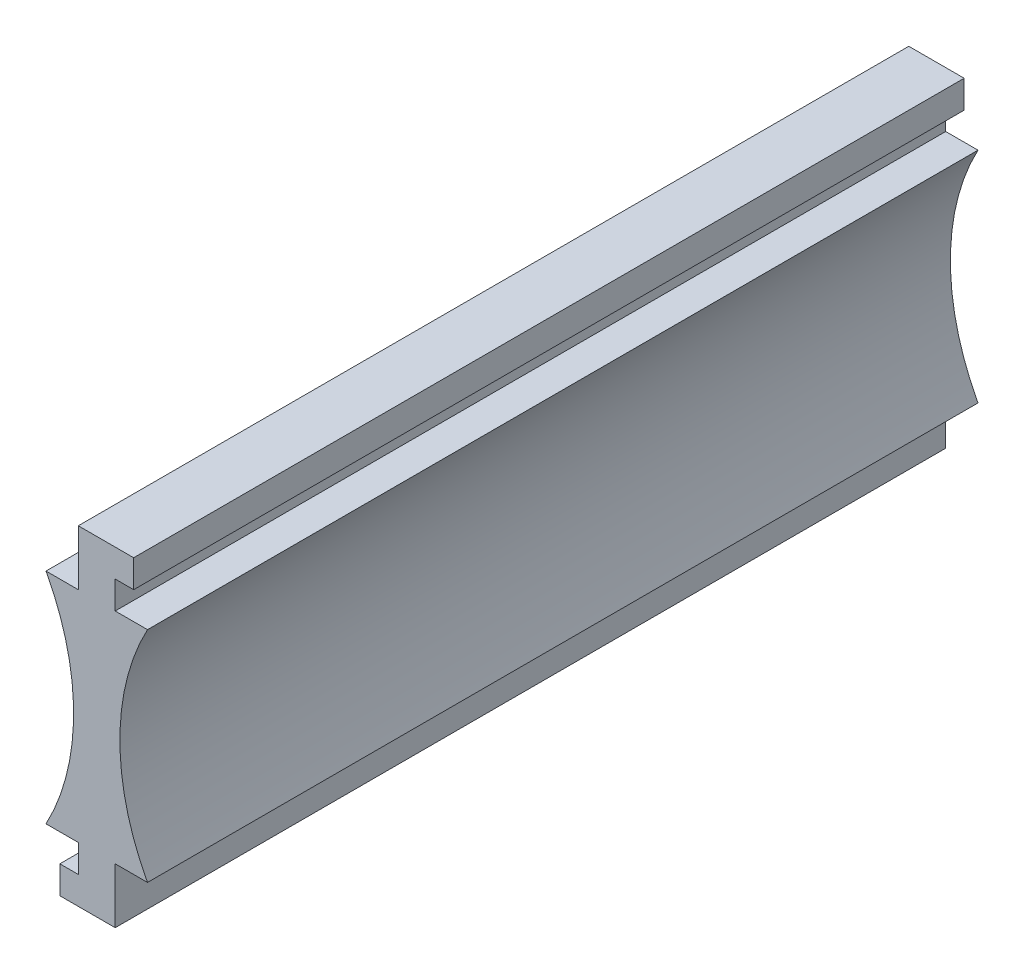
ISO-10303-21;
HEADER;
FILE_DESCRIPTION(('STEP AP214'),'2;1');
FILE_NAME('part.step','',(''),(''),'','','');
FILE_SCHEMA(('AUTOMOTIVE_DESIGN { 1 0 10303 214 1 1 1 1 }'));
ENDSEC;
DATA;
#1=APPLICATION_CONTEXT('core data for automotive mechanical design processes');
#2=APPLICATION_PROTOCOL_DEFINITION('international standard','automotive_design',2000,#1);
#3=PRODUCT_CONTEXT('',#1,'mechanical');
#4=PRODUCT('Part','Part','',(#3));
#5=PRODUCT_RELATED_PRODUCT_CATEGORY('part','',(#4));
#6=PRODUCT_DEFINITION_FORMATION('','',#4);
#7=PRODUCT_DEFINITION_CONTEXT('part definition',#1,'design');
#8=PRODUCT_DEFINITION('design','',#6,#7);
#9=PRODUCT_DEFINITION_SHAPE('','',#8);
#10=(LENGTH_UNIT() NAMED_UNIT(*) SI_UNIT(.MILLI.,.METRE.));
#11=(NAMED_UNIT(*) PLANE_ANGLE_UNIT() SI_UNIT($,.RADIAN.));
#12=(NAMED_UNIT(*) SI_UNIT($,.STERADIAN.) SOLID_ANGLE_UNIT());
#13=UNCERTAINTY_MEASURE_WITH_UNIT(LENGTH_MEASURE(1.E-05),#10,'distance_accuracy_value','');
#14=(GEOMETRIC_REPRESENTATION_CONTEXT(3) GLOBAL_UNCERTAINTY_ASSIGNED_CONTEXT((#13)) GLOBAL_UNIT_ASSIGNED_CONTEXT((#10,
#11,#12)) REPRESENTATION_CONTEXT('',''));
#15=CARTESIAN_POINT('',(0.,0.,0.));
#16=DIRECTION('',(0.,0.,1.));
#17=DIRECTION('',(1.,0.,0.));
#18=AXIS2_PLACEMENT_3D('',#15,#16,#17);
#19=CARTESIAN_POINT('',(-55.0127751340449,0.,-180.));
#20=DIRECTION('',(0.,0.,1.));
#21=DIRECTION('',(1.,0.,0.));
#22=AXIS2_PLACEMENT_3D('',#19,#20,#21);
#23=CYLINDRICAL_SURFACE('',#22,50.);
#24=CARTESIAN_POINT('',(-55.0127751340449,0.,0.));
#25=DIRECTION('',(0.,0.,-1.));
#26=DIRECTION('',(1.,0.,0.));
#27=AXIS2_PLACEMENT_3D('',#24,#25,#26);
#28=CIRCLE('',#27,50.);
#29=CARTESIAN_POINT('',(-11.,23.725,0.));
#30=VERTEX_POINT('',#29);
#31=CARTESIAN_POINT('',(-11.,-23.725,0.));
#32=VERTEX_POINT('',#31);
#33=EDGE_CURVE('E182',#30,#32,#28,.T.);
#34=ORIENTED_EDGE('',*,*,#33,.F.);
#35=DIRECTION('',(0.,0.,1.));
#36=VECTOR('',#35,1.);
#37=CARTESIAN_POINT('',(-11.,23.725,-180.));
#38=LINE('',#37,#36);
#39=CARTESIAN_POINT('',(-11.,23.725,-180.));
#40=VERTEX_POINT('',#39);
#41=EDGE_CURVE('E11',#40,#30,#38,.T.);
#42=ORIENTED_EDGE('',*,*,#41,.F.);
#43=CARTESIAN_POINT('',(-55.0127751340449,0.,-180.));
#44=DIRECTION('',(0.,0.,-1.));
#45=DIRECTION('',(1.,0.,0.));
#46=AXIS2_PLACEMENT_3D('',#43,#44,#45);
#47=CIRCLE('',#46,50.);
#48=CARTESIAN_POINT('',(-11.,-23.725,-180.));
#49=VERTEX_POINT('',#48);
#50=EDGE_CURVE('E226',#40,#49,#47,.T.);
#51=ORIENTED_EDGE('',*,*,#50,.T.);
#52=DIRECTION('',(0.,0.,1.));
#53=VECTOR('',#52,1.);
#54=CARTESIAN_POINT('',(-11.,-23.725,-180.));
#55=LINE('',#54,#53);
#56=EDGE_CURVE('E40',#49,#32,#55,.T.);
#57=ORIENTED_EDGE('',*,*,#56,.T.);
#58=EDGE_LOOP('',(#34,#42,#51,#57));
#59=FACE_BOUND('',#58,.T.);
#60=ADVANCED_FACE('F37',(#59),#23,.F.);
#61=CARTESIAN_POINT('',(-11.,23.725,-180.));
#62=DIRECTION('',(0.,1.,0.));
#63=DIRECTION('',(-1.,0.,0.));
#64=AXIS2_PLACEMENT_3D('',#61,#62,#63);
#65=PLANE('',#64);
#66=DIRECTION('',(-1.,0.,0.));
#67=VECTOR('',#66,1.);
#68=CARTESIAN_POINT('',(-11.,23.725,0.));
#69=LINE('',#68,#67);
#70=CARTESIAN_POINT('',(-3.99999999999999,23.725,0.));
#71=VERTEX_POINT('',#70);
#72=EDGE_CURVE('E224',#71,#30,#69,.T.);
#73=ORIENTED_EDGE('',*,*,#72,.F.);
#74=DIRECTION('',(0.,0.,1.));
#75=VECTOR('',#74,1.);
#76=CARTESIAN_POINT('',(-3.99999999999999,23.725,-180.));
#77=LINE('',#76,#75);
#78=CARTESIAN_POINT('',(-3.99999999999999,23.725,-180.));
#79=VERTEX_POINT('',#78);
#80=EDGE_CURVE('E46',#79,#71,#77,.T.);
#81=ORIENTED_EDGE('',*,*,#80,.F.);
#82=DIRECTION('',(-1.,0.,0.));
#83=VECTOR('',#82,1.);
#84=CARTESIAN_POINT('',(-11.,23.725,-180.));
#85=LINE('',#84,#83);
#86=EDGE_CURVE('E172',#79,#40,#85,.T.);
#87=ORIENTED_EDGE('',*,*,#86,.T.);
#88=ORIENTED_EDGE('',*,*,#41,.T.);
#89=EDGE_LOOP('',(#73,#81,#87,#88));
#90=FACE_BOUND('',#89,.T.);
#91=ADVANCED_FACE('F254',(#90),#65,.T.);
#92=CARTESIAN_POINT('',(-3.99999999999999,35.7250000000001,-180.));
#93=DIRECTION('',(-1.,0.,0.));
#94=DIRECTION('',(0.,0.,1.));
#95=AXIS2_PLACEMENT_3D('',#92,#93,#94);
#96=PLANE('',#95);
#97=DIRECTION('',(0.,-1.,0.));
#98=VECTOR('',#97,1.);
#99=CARTESIAN_POINT('',(-3.99999999999999,35.7250000000001,0.));
#100=LINE('',#99,#98);
#101=CARTESIAN_POINT('',(-3.99999999999999,35.7250000000001,0.));
#102=VERTEX_POINT('',#101);
#103=EDGE_CURVE('E159',#102,#71,#100,.T.);
#104=ORIENTED_EDGE('',*,*,#103,.F.);
#105=DIRECTION('',(0.,0.,1.));
#106=VECTOR('',#105,1.);
#107=CARTESIAN_POINT('',(-3.99999999999999,35.7250000000001,-180.));
#108=LINE('',#107,#106);
#109=CARTESIAN_POINT('',(-3.99999999999999,35.7250000000001,-180.));
#110=VERTEX_POINT('',#109);
#111=EDGE_CURVE('E154',#110,#102,#108,.T.);
#112=ORIENTED_EDGE('',*,*,#111,.F.);
#113=DIRECTION('',(0.,-1.,0.));
#114=VECTOR('',#113,1.);
#115=CARTESIAN_POINT('',(-3.99999999999999,35.7250000000001,-180.));
#116=LINE('',#115,#114);
#117=EDGE_CURVE('E157',#110,#79,#116,.T.);
#118=ORIENTED_EDGE('',*,*,#117,.T.);
#119=ORIENTED_EDGE('',*,*,#80,.T.);
#120=EDGE_LOOP('',(#104,#112,#118,#119));
#121=FACE_BOUND('',#120,.T.);
#122=ADVANCED_FACE('F156',(#121),#96,.T.);
#123=CARTESIAN_POINT('',(8.00000000000001,35.7250000000001,-180.));
#124=DIRECTION('',(0.,1.,0.));
#125=DIRECTION('',(0.,0.,1.));
#126=AXIS2_PLACEMENT_3D('',#123,#124,#125);
#127=PLANE('',#126);
#128=DIRECTION('',(-1.,0.,0.));
#129=VECTOR('',#128,1.);
#130=CARTESIAN_POINT('',(8.00000000000001,35.7250000000001,0.));
#131=LINE('',#130,#129);
#132=CARTESIAN_POINT('',(8.00000000000001,35.7250000000001,0.));
#133=VERTEX_POINT('',#132);
#134=EDGE_CURVE('E221',#133,#102,#131,.T.);
#135=ORIENTED_EDGE('',*,*,#134,.F.);
#136=DIRECTION('',(0.,0.,1.));
#137=VECTOR('',#136,1.);
#138=CARTESIAN_POINT('',(8.00000000000001,35.7250000000001,-180.));
#139=LINE('',#138,#137);
#140=CARTESIAN_POINT('',(8.00000000000001,35.7250000000001,-180.));
#141=VERTEX_POINT('',#140);
#142=EDGE_CURVE('E164',#141,#133,#139,.T.);
#143=ORIENTED_EDGE('',*,*,#142,.F.);
#144=DIRECTION('',(-1.,0.,0.));
#145=VECTOR('',#144,1.);
#146=CARTESIAN_POINT('',(8.00000000000001,35.7250000000001,-180.));
#147=LINE('',#146,#145);
#148=EDGE_CURVE('E170',#141,#110,#147,.T.);
#149=ORIENTED_EDGE('',*,*,#148,.T.);
#150=ORIENTED_EDGE('',*,*,#111,.T.);
#151=EDGE_LOOP('',(#135,#143,#149,#150));
#152=FACE_BOUND('',#151,.T.);
#153=ADVANCED_FACE('F174',(#152),#127,.T.);
#154=CARTESIAN_POINT('',(8.00000000000001,29.7250000000001,-180.));
#155=DIRECTION('',(1.,0.,0.));
#156=DIRECTION('',(0.,0.,-1.));
#157=AXIS2_PLACEMENT_3D('',#154,#155,#156);
#158=PLANE('',#157);
#159=DIRECTION('',(0.,1.,0.));
#160=VECTOR('',#159,1.);
#161=CARTESIAN_POINT('',(8.00000000000001,29.7250000000001,0.));
#162=LINE('',#161,#160);
#163=CARTESIAN_POINT('',(8.00000000000001,29.7250000000001,0.));
#164=VERTEX_POINT('',#163);
#165=EDGE_CURVE('E218',#164,#133,#162,.T.);
#166=ORIENTED_EDGE('',*,*,#165,.F.);
#167=DIRECTION('',(0.,0.,1.));
#168=VECTOR('',#167,1.);
#169=CARTESIAN_POINT('',(8.00000000000001,29.7250000000001,-180.));
#170=LINE('',#169,#168);
#171=CARTESIAN_POINT('',(8.00000000000001,29.7250000000001,-180.));
#172=VERTEX_POINT('',#171);
#173=EDGE_CURVE('E230',#172,#164,#170,.T.);
#174=ORIENTED_EDGE('',*,*,#173,.F.);
#175=DIRECTION('',(0.,1.,0.));
#176=VECTOR('',#175,1.);
#177=CARTESIAN_POINT('',(8.00000000000001,29.7250000000001,-180.));
#178=LINE('',#177,#176);
#179=EDGE_CURVE('E175',#172,#141,#178,.T.);
#180=ORIENTED_EDGE('',*,*,#179,.T.);
#181=ORIENTED_EDGE('',*,*,#142,.T.);
#182=EDGE_LOOP('',(#166,#174,#180,#181));
#183=FACE_BOUND('',#182,.T.);
#184=ADVANCED_FACE('F267',(#183),#158,.T.);
#185=CARTESIAN_POINT('',(4.00000000000001,29.7250000000001,-180.));
#186=DIRECTION('',(0.,-1.,0.));
#187=DIRECTION('',(0.,0.,-1.));
#188=AXIS2_PLACEMENT_3D('',#185,#186,#187);
#189=PLANE('',#188);
#190=DIRECTION('',(1.,0.,0.));
#191=VECTOR('',#190,1.);
#192=CARTESIAN_POINT('',(4.00000000000001,29.7250000000001,0.));
#193=LINE('',#192,#191);
#194=CARTESIAN_POINT('',(4.00000000000001,29.7250000000001,0.));
#195=VERTEX_POINT('',#194);
#196=EDGE_CURVE('E215',#195,#164,#193,.T.);
#197=ORIENTED_EDGE('',*,*,#196,.F.);
#198=DIRECTION('',(0.,0.,1.));
#199=VECTOR('',#198,1.);
#200=CARTESIAN_POINT('',(4.00000000000001,29.7250000000001,-180.));
#201=LINE('',#200,#199);
#202=CARTESIAN_POINT('',(4.00000000000001,29.7250000000001,-180.));
#203=VERTEX_POINT('',#202);
#204=EDGE_CURVE('E232',#203,#195,#201,.T.);
#205=ORIENTED_EDGE('',*,*,#204,.F.);
#206=DIRECTION('',(1.,0.,0.));
#207=VECTOR('',#206,1.);
#208=CARTESIAN_POINT('',(4.00000000000001,29.7250000000001,-180.));
#209=LINE('',#208,#207);
#210=EDGE_CURVE('E177',#203,#172,#209,.T.);
#211=ORIENTED_EDGE('',*,*,#210,.T.);
#212=ORIENTED_EDGE('',*,*,#173,.T.);
#213=EDGE_LOOP('',(#197,#205,#211,#212));
#214=FACE_BOUND('',#213,.T.);
#215=ADVANCED_FACE('F270',(#214),#189,.T.);
#216=CARTESIAN_POINT('',(4.00000000000001,23.725,-180.));
#217=DIRECTION('',(1.,0.,0.));
#218=DIRECTION('',(0.,0.,-1.));
#219=AXIS2_PLACEMENT_3D('',#216,#217,#218);
#220=PLANE('',#219);
#221=DIRECTION('',(0.,1.,0.));
#222=VECTOR('',#221,1.);
#223=CARTESIAN_POINT('',(4.00000000000001,23.725,0.));
#224=LINE('',#223,#222);
#225=CARTESIAN_POINT('',(4.00000000000001,23.725,0.));
#226=VERTEX_POINT('',#225);
#227=EDGE_CURVE('E212',#226,#195,#224,.T.);
#228=ORIENTED_EDGE('',*,*,#227,.F.);
#229=DIRECTION('',(0.,0.,1.));
#230=VECTOR('',#229,1.);
#231=CARTESIAN_POINT('',(4.00000000000001,23.725,-180.));
#232=LINE('',#231,#230);
#233=CARTESIAN_POINT('',(4.00000000000001,23.725,-180.));
#234=VERTEX_POINT('',#233);
#235=EDGE_CURVE('E234',#234,#226,#232,.T.);
#236=ORIENTED_EDGE('',*,*,#235,.F.);
#237=DIRECTION('',(0.,1.,0.));
#238=VECTOR('',#237,1.);
#239=CARTESIAN_POINT('',(4.00000000000001,23.725,-180.));
#240=LINE('',#239,#238);
#241=EDGE_CURVE('E487',#234,#203,#240,.T.);
#242=ORIENTED_EDGE('',*,*,#241,.T.);
#243=ORIENTED_EDGE('',*,*,#204,.T.);
#244=EDGE_LOOP('',(#228,#236,#242,#243));
#245=FACE_BOUND('',#244,.T.);
#246=ADVANCED_FACE('F274',(#245),#220,.T.);
#247=CARTESIAN_POINT('',(4.00000000000001,23.725,-180.));
#248=DIRECTION('',(0.,1.,0.));
#249=DIRECTION('',(-1.,0.,0.));
#250=AXIS2_PLACEMENT_3D('',#247,#248,#249);
#251=PLANE('',#250);
#252=DIRECTION('',(-1.,0.,0.));
#253=VECTOR('',#252,1.);
#254=CARTESIAN_POINT('',(4.00000000000001,23.725,0.));
#255=LINE('',#254,#253);
#256=CARTESIAN_POINT('',(11.,23.725,0.));
#257=VERTEX_POINT('',#256);
#258=EDGE_CURVE('E209',#257,#226,#255,.T.);
#259=ORIENTED_EDGE('',*,*,#258,.F.);
#260=DIRECTION('',(0.,0.,1.));
#261=VECTOR('',#260,1.);
#262=CARTESIAN_POINT('',(11.,23.725,-180.));
#263=LINE('',#262,#261);
#264=CARTESIAN_POINT('',(11.,23.725,-180.));
#265=VERTEX_POINT('',#264);
#266=EDGE_CURVE('E236',#265,#257,#263,.T.);
#267=ORIENTED_EDGE('',*,*,#266,.F.);
#268=DIRECTION('',(-1.,0.,0.));
#269=VECTOR('',#268,1.);
#270=CARTESIAN_POINT('',(4.00000000000001,23.725,-180.));
#271=LINE('',#270,#269);
#272=EDGE_CURVE('E483',#265,#234,#271,.T.);
#273=ORIENTED_EDGE('',*,*,#272,.T.);
#274=ORIENTED_EDGE('',*,*,#235,.T.);
#275=EDGE_LOOP('',(#259,#267,#273,#274));
#276=FACE_BOUND('',#275,.T.);
#277=ADVANCED_FACE('F278',(#276),#251,.T.);
#278=CARTESIAN_POINT('',(55.0127751340449,0.,-180.));
#279=DIRECTION('',(0.,0.,1.));
#280=DIRECTION('',(1.,0.,0.));
#281=AXIS2_PLACEMENT_3D('',#278,#279,#280);
#282=CYLINDRICAL_SURFACE('',#281,50.);
#283=CARTESIAN_POINT('',(55.0127751340449,0.,0.));
#284=DIRECTION('',(0.,0.,-1.));
#285=DIRECTION('',(-1.,0.,0.));
#286=AXIS2_PLACEMENT_3D('',#283,#284,#285);
#287=CIRCLE('',#286,50.);
#288=CARTESIAN_POINT('',(11.,-23.725,0.));
#289=VERTEX_POINT('',#288);
#290=EDGE_CURVE('E206',#289,#257,#287,.T.);
#291=ORIENTED_EDGE('',*,*,#290,.F.);
#292=DIRECTION('',(0.,0.,1.));
#293=VECTOR('',#292,1.);
#294=CARTESIAN_POINT('',(11.,-23.725,-180.));
#295=LINE('',#294,#293);
#296=CARTESIAN_POINT('',(11.,-23.725,-180.));
#297=VERTEX_POINT('',#296);
#298=EDGE_CURVE('E238',#297,#289,#295,.T.);
#299=ORIENTED_EDGE('',*,*,#298,.F.);
#300=CARTESIAN_POINT('',(55.0127751340449,0.,-180.));
#301=DIRECTION('',(0.,0.,-1.));
#302=DIRECTION('',(-1.,0.,0.));
#303=AXIS2_PLACEMENT_3D('',#300,#301,#302);
#304=CIRCLE('',#303,50.);
#305=EDGE_CURVE('E494',#297,#265,#304,.T.);
#306=ORIENTED_EDGE('',*,*,#305,.T.);
#307=ORIENTED_EDGE('',*,*,#266,.T.);
#308=EDGE_LOOP('',(#291,#299,#306,#307));
#309=FACE_BOUND('',#308,.T.);
#310=ADVANCED_FACE('F282',(#309),#282,.F.);
#311=CARTESIAN_POINT('',(4.00000000000001,-23.7250000000001,-180.));
#312=DIRECTION('',(0.,-1.,0.));
#313=DIRECTION('',(1.,0.,0.));
#314=AXIS2_PLACEMENT_3D('',#311,#312,#313);
#315=PLANE('',#314);
#316=DIRECTION('',(1.,0.,0.));
#317=VECTOR('',#316,1.);
#318=CARTESIAN_POINT('',(4.00000000000001,-23.7250000000001,0.));
#319=LINE('',#318,#317);
#320=CARTESIAN_POINT('',(4.00000000000001,-23.7250000000001,0.));
#321=VERTEX_POINT('',#320);
#322=EDGE_CURVE('E203',#321,#289,#319,.T.);
#323=ORIENTED_EDGE('',*,*,#322,.F.);
#324=DIRECTION('',(0.,0.,1.));
#325=VECTOR('',#324,1.);
#326=CARTESIAN_POINT('',(4.00000000000001,-23.7250000000001,-180.));
#327=LINE('',#326,#325);
#328=CARTESIAN_POINT('',(4.00000000000001,-23.7250000000001,-180.));
#329=VERTEX_POINT('',#328);
#330=EDGE_CURVE('E240',#329,#321,#327,.T.);
#331=ORIENTED_EDGE('',*,*,#330,.F.);
#332=DIRECTION('',(1.,0.,0.));
#333=VECTOR('',#332,1.);
#334=CARTESIAN_POINT('',(4.00000000000001,-23.7250000000001,-180.));
#335=LINE('',#334,#333);
#336=EDGE_CURVE('E476',#329,#297,#335,.T.);
#337=ORIENTED_EDGE('',*,*,#336,.T.);
#338=ORIENTED_EDGE('',*,*,#298,.T.);
#339=EDGE_LOOP('',(#323,#331,#337,#338));
#340=FACE_BOUND('',#339,.T.);
#341=ADVANCED_FACE('F286',(#340),#315,.T.);
#342=CARTESIAN_POINT('',(4.00000000000001,-23.7250000000001,-180.));
#343=DIRECTION('',(1.,0.,0.));
#344=DIRECTION('',(0.,0.,-1.));
#345=AXIS2_PLACEMENT_3D('',#342,#343,#344);
#346=PLANE('',#345);
#347=DIRECTION('',(0.,1.,0.));
#348=VECTOR('',#347,1.);
#349=CARTESIAN_POINT('',(4.00000000000001,-23.7250000000001,0.));
#350=LINE('',#349,#348);
#351=CARTESIAN_POINT('',(4.00000000000001,-35.725,0.));
#352=VERTEX_POINT('',#351);
#353=EDGE_CURVE('E200',#352,#321,#350,.T.);
#354=ORIENTED_EDGE('',*,*,#353,.F.);
#355=DIRECTION('',(0.,0.,1.));
#356=VECTOR('',#355,1.);
#357=CARTESIAN_POINT('',(4.00000000000001,-35.725,-180.));
#358=LINE('',#357,#356);
#359=CARTESIAN_POINT('',(4.00000000000001,-35.725,-180.));
#360=VERTEX_POINT('',#359);
#361=EDGE_CURVE('E242',#360,#352,#358,.T.);
#362=ORIENTED_EDGE('',*,*,#361,.F.);
#363=DIRECTION('',(0.,1.,0.));
#364=VECTOR('',#363,1.);
#365=CARTESIAN_POINT('',(4.00000000000001,-23.7250000000001,-180.));
#366=LINE('',#365,#364);
#367=EDGE_CURVE('E472',#360,#329,#366,.T.);
#368=ORIENTED_EDGE('',*,*,#367,.T.);
#369=ORIENTED_EDGE('',*,*,#330,.T.);
#370=EDGE_LOOP('',(#354,#362,#368,#369));
#371=FACE_BOUND('',#370,.T.);
#372=ADVANCED_FACE('F290',(#371),#346,.T.);
#373=CARTESIAN_POINT('',(4.00000000000001,-35.725,-180.));
#374=DIRECTION('',(0.,-1.,0.));
#375=DIRECTION('',(1.,0.,0.));
#376=AXIS2_PLACEMENT_3D('',#373,#374,#375);
#377=PLANE('',#376);
#378=DIRECTION('',(1.,0.,0.));
#379=VECTOR('',#378,1.);
#380=CARTESIAN_POINT('',(4.00000000000001,-35.725,0.));
#381=LINE('',#380,#379);
#382=CARTESIAN_POINT('',(-7.99999999999999,-35.7250000000001,0.));
#383=VERTEX_POINT('',#382);
#384=EDGE_CURVE('E197',#383,#352,#381,.T.);
#385=ORIENTED_EDGE('',*,*,#384,.F.);
#386=DIRECTION('',(0.,0.,1.));
#387=VECTOR('',#386,1.);
#388=CARTESIAN_POINT('',(-7.99999999999999,-35.7250000000001,-180.));
#389=LINE('',#388,#387);
#390=CARTESIAN_POINT('',(-7.99999999999999,-35.7250000000001,-180.));
#391=VERTEX_POINT('',#390);
#392=EDGE_CURVE('E244',#391,#383,#389,.T.);
#393=ORIENTED_EDGE('',*,*,#392,.F.);
#394=DIRECTION('',(1.,0.,0.));
#395=VECTOR('',#394,1.);
#396=CARTESIAN_POINT('',(4.00000000000001,-35.725,-180.));
#397=LINE('',#396,#395);
#398=EDGE_CURVE('E498',#391,#360,#397,.T.);
#399=ORIENTED_EDGE('',*,*,#398,.T.);
#400=ORIENTED_EDGE('',*,*,#361,.T.);
#401=EDGE_LOOP('',(#385,#393,#399,#400));
#402=FACE_BOUND('',#401,.T.);
#403=ADVANCED_FACE('F294',(#402),#377,.T.);
#404=CARTESIAN_POINT('',(-7.99999999999999,-35.7250000000001,-180.));
#405=DIRECTION('',(-1.,0.,0.));
#406=DIRECTION('',(0.,0.,1.));
#407=AXIS2_PLACEMENT_3D('',#404,#405,#406);
#408=PLANE('',#407);
#409=DIRECTION('',(0.,-1.,0.));
#410=VECTOR('',#409,1.);
#411=CARTESIAN_POINT('',(-7.99999999999999,-35.7250000000001,0.));
#412=LINE('',#411,#410);
#413=CARTESIAN_POINT('',(-7.99999999999999,-29.7250000000001,0.));
#414=VERTEX_POINT('',#413);
#415=EDGE_CURVE('E194',#414,#383,#412,.T.);
#416=ORIENTED_EDGE('',*,*,#415,.F.);
#417=DIRECTION('',(0.,0.,1.));
#418=VECTOR('',#417,1.);
#419=CARTESIAN_POINT('',(-7.99999999999999,-29.7250000000001,-180.));
#420=LINE('',#419,#418);
#421=CARTESIAN_POINT('',(-7.99999999999999,-29.7250000000001,-180.));
#422=VERTEX_POINT('',#421);
#423=EDGE_CURVE('E246',#422,#414,#420,.T.);
#424=ORIENTED_EDGE('',*,*,#423,.F.);
#425=DIRECTION('',(0.,-1.,0.));
#426=VECTOR('',#425,1.);
#427=CARTESIAN_POINT('',(-7.99999999999999,-35.7250000000001,-180.));
#428=LINE('',#427,#426);
#429=EDGE_CURVE('E465',#422,#391,#428,.T.);
#430=ORIENTED_EDGE('',*,*,#429,.T.);
#431=ORIENTED_EDGE('',*,*,#392,.T.);
#432=EDGE_LOOP('',(#416,#424,#430,#431));
#433=FACE_BOUND('',#432,.T.);
#434=ADVANCED_FACE('F298',(#433),#408,.T.);
#435=CARTESIAN_POINT('',(-7.99999999999999,-29.7250000000001,-180.));
#436=DIRECTION('',(0.,1.,0.));
#437=DIRECTION('',(-1.,0.,0.));
#438=AXIS2_PLACEMENT_3D('',#435,#436,#437);
#439=PLANE('',#438);
#440=DIRECTION('',(-1.,0.,0.));
#441=VECTOR('',#440,1.);
#442=CARTESIAN_POINT('',(-7.99999999999999,-29.7250000000001,0.));
#443=LINE('',#442,#441);
#444=CARTESIAN_POINT('',(-3.99999999999999,-29.7250000000001,0.));
#445=VERTEX_POINT('',#444);
#446=EDGE_CURVE('E191',#445,#414,#443,.T.);
#447=ORIENTED_EDGE('',*,*,#446,.F.);
#448=DIRECTION('',(0.,0.,1.));
#449=VECTOR('',#448,1.);
#450=CARTESIAN_POINT('',(-3.99999999999999,-29.7250000000001,-180.));
#451=LINE('',#450,#449);
#452=CARTESIAN_POINT('',(-3.99999999999999,-29.7250000000001,-180.));
#453=VERTEX_POINT('',#452);
#454=EDGE_CURVE('E248',#453,#445,#451,.T.);
#455=ORIENTED_EDGE('',*,*,#454,.F.);
#456=DIRECTION('',(-1.,0.,0.));
#457=VECTOR('',#456,1.);
#458=CARTESIAN_POINT('',(-7.99999999999999,-29.7250000000001,-180.));
#459=LINE('',#458,#457);
#460=EDGE_CURVE('E461',#453,#422,#459,.T.);
#461=ORIENTED_EDGE('',*,*,#460,.T.);
#462=ORIENTED_EDGE('',*,*,#423,.T.);
#463=EDGE_LOOP('',(#447,#455,#461,#462));
#464=FACE_BOUND('',#463,.T.);
#465=ADVANCED_FACE('F302',(#464),#439,.T.);
#466=CARTESIAN_POINT('',(-3.99999999999999,-29.7250000000001,-180.));
#467=DIRECTION('',(-1.,0.,0.));
#468=DIRECTION('',(0.,0.,1.));
#469=AXIS2_PLACEMENT_3D('',#466,#467,#468);
#470=PLANE('',#469);
#471=DIRECTION('',(0.,-1.,0.));
#472=VECTOR('',#471,1.);
#473=CARTESIAN_POINT('',(-3.99999999999999,-29.7250000000001,0.));
#474=LINE('',#473,#472);
#475=CARTESIAN_POINT('',(-3.99999999999999,-23.7250000000001,0.));
#476=VERTEX_POINT('',#475);
#477=EDGE_CURVE('E188',#476,#445,#474,.T.);
#478=ORIENTED_EDGE('',*,*,#477,.F.);
#479=DIRECTION('',(0.,0.,1.));
#480=VECTOR('',#479,1.);
#481=CARTESIAN_POINT('',(-3.99999999999999,-23.7250000000001,-180.));
#482=LINE('',#481,#480);
#483=CARTESIAN_POINT('',(-3.99999999999999,-23.7250000000001,-180.));
#484=VERTEX_POINT('',#483);
#485=EDGE_CURVE('E249',#484,#476,#482,.T.);
#486=ORIENTED_EDGE('',*,*,#485,.F.);
#487=DIRECTION('',(0.,-1.,0.));
#488=VECTOR('',#487,1.);
#489=CARTESIAN_POINT('',(-3.99999999999999,-29.7250000000001,-180.));
#490=LINE('',#489,#488);
#491=EDGE_CURVE('E502',#484,#453,#490,.T.);
#492=ORIENTED_EDGE('',*,*,#491,.T.);
#493=ORIENTED_EDGE('',*,*,#454,.T.);
#494=EDGE_LOOP('',(#478,#486,#492,#493));
#495=FACE_BOUND('',#494,.T.);
#496=ADVANCED_FACE('F306',(#495),#470,.T.);
#497=CARTESIAN_POINT('',(-11.,-23.725,-180.));
#498=DIRECTION('',(0.,-1.,0.));
#499=DIRECTION('',(1.,0.,0.));
#500=AXIS2_PLACEMENT_3D('',#497,#498,#499);
#501=PLANE('',#500);
#502=DIRECTION('',(1.,0.,0.));
#503=VECTOR('',#502,1.);
#504=CARTESIAN_POINT('',(-11.,-23.725,0.));
#505=LINE('',#504,#503);
#506=EDGE_CURVE('E185',#32,#476,#505,.T.);
#507=ORIENTED_EDGE('',*,*,#506,.F.);
#508=ORIENTED_EDGE('',*,*,#56,.F.);
#509=DIRECTION('',(1.,0.,0.));
#510=VECTOR('',#509,1.);
#511=CARTESIAN_POINT('',(-11.,-23.725,-180.));
#512=LINE('',#511,#510);
#513=EDGE_CURVE('E504',#49,#484,#512,.T.);
#514=ORIENTED_EDGE('',*,*,#513,.T.);
#515=ORIENTED_EDGE('',*,*,#485,.T.);
#516=EDGE_LOOP('',(#507,#508,#514,#515));
#517=FACE_BOUND('',#516,.T.);
#518=ADVANCED_FACE('F251',(#517),#501,.T.);
#519=CARTESIAN_POINT('',(-55.0127751340449,0.,-180.));
#520=DIRECTION('',(0.,0.,1.));
#521=DIRECTION('',(1.,0.,0.));
#522=AXIS2_PLACEMENT_3D('',#519,#520,#521);
#523=PLANE('',#522);
#524=ORIENTED_EDGE('',*,*,#50,.F.);
#525=ORIENTED_EDGE('',*,*,#86,.F.);
#526=ORIENTED_EDGE('',*,*,#117,.F.);
#527=ORIENTED_EDGE('',*,*,#148,.F.);
#528=ORIENTED_EDGE('',*,*,#179,.F.);
#529=ORIENTED_EDGE('',*,*,#210,.F.);
#530=ORIENTED_EDGE('',*,*,#241,.F.);
#531=ORIENTED_EDGE('',*,*,#272,.F.);
#532=ORIENTED_EDGE('',*,*,#305,.F.);
#533=ORIENTED_EDGE('',*,*,#336,.F.);
#534=ORIENTED_EDGE('',*,*,#367,.F.);
#535=ORIENTED_EDGE('',*,*,#398,.F.);
#536=ORIENTED_EDGE('',*,*,#429,.F.);
#537=ORIENTED_EDGE('',*,*,#460,.F.);
#538=ORIENTED_EDGE('',*,*,#491,.F.);
#539=ORIENTED_EDGE('',*,*,#513,.F.);
#540=EDGE_LOOP('',(#524,#525,#526,#527,#528,#529,#530,#531,#532,#533,#534,#535,#536,#537,#538,#539));
#541=FACE_BOUND('',#540,.T.);
#542=ADVANCED_FACE('F168',(#541),#523,.F.);
#543=CARTESIAN_POINT('',(-55.0127751340449,0.,0.));
#544=DIRECTION('',(0.,0.,1.));
#545=DIRECTION('',(1.,0.,0.));
#546=AXIS2_PLACEMENT_3D('',#543,#544,#545);
#547=PLANE('',#546);
#548=ORIENTED_EDGE('',*,*,#33,.T.);
#549=ORIENTED_EDGE('',*,*,#506,.T.);
#550=ORIENTED_EDGE('',*,*,#477,.T.);
#551=ORIENTED_EDGE('',*,*,#446,.T.);
#552=ORIENTED_EDGE('',*,*,#415,.T.);
#553=ORIENTED_EDGE('',*,*,#384,.T.);
#554=ORIENTED_EDGE('',*,*,#353,.T.);
#555=ORIENTED_EDGE('',*,*,#322,.T.);
#556=ORIENTED_EDGE('',*,*,#290,.T.);
#557=ORIENTED_EDGE('',*,*,#258,.T.);
#558=ORIENTED_EDGE('',*,*,#227,.T.);
#559=ORIENTED_EDGE('',*,*,#196,.T.);
#560=ORIENTED_EDGE('',*,*,#165,.T.);
#561=ORIENTED_EDGE('',*,*,#134,.T.);
#562=ORIENTED_EDGE('',*,*,#103,.T.);
#563=ORIENTED_EDGE('',*,*,#72,.T.);
#564=EDGE_LOOP('',(#548,#549,#550,#551,#552,#553,#554,#555,#556,#557,#558,#559,#560,#561,#562,#563));
#565=FACE_BOUND('',#564,.T.);
#566=ADVANCED_FACE('F253',(#565),#547,.T.);
#567=CLOSED_SHELL('',(#60,#91,#122,#153,#184,#215,#246,#277,#310,#341,#372,#403,#434,#465,#496,
#518,#542,#566));
#568=MANIFOLD_SOLID_BREP('B2',#567);
#569=ADVANCED_BREP_SHAPE_REPRESENTATION('',(#18,#568),#14);
#570=SHAPE_DEFINITION_REPRESENTATION(#9,#569);
ENDSEC;
END-ISO-10303-21;
